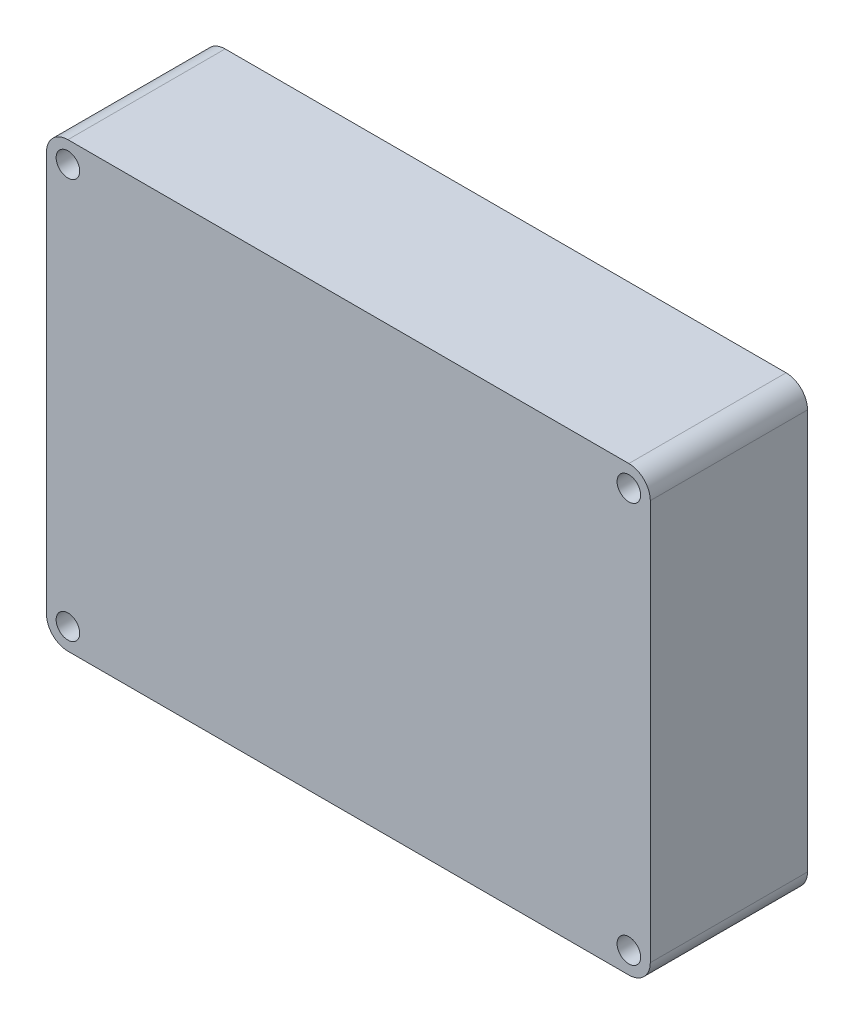
ISO-10303-21;
HEADER;
FILE_DESCRIPTION(('STEP AP214'),'2;1');
FILE_NAME('part.step','',(''),(''),'','','');
FILE_SCHEMA(('AUTOMOTIVE_DESIGN { 1 0 10303 214 1 1 1 1 }'));
ENDSEC;
DATA;
#1=APPLICATION_CONTEXT('core data for automotive mechanical design processes');
#2=APPLICATION_PROTOCOL_DEFINITION('international standard','automotive_design',2000,#1);
#3=PRODUCT_CONTEXT('',#1,'mechanical');
#4=PRODUCT('Part','Part','',(#3));
#5=PRODUCT_RELATED_PRODUCT_CATEGORY('part','',(#4));
#6=PRODUCT_DEFINITION_FORMATION('','',#4);
#7=PRODUCT_DEFINITION_CONTEXT('part definition',#1,'design');
#8=PRODUCT_DEFINITION('design','',#6,#7);
#9=PRODUCT_DEFINITION_SHAPE('','',#8);
#10=(LENGTH_UNIT() NAMED_UNIT(*) SI_UNIT(.MILLI.,.METRE.));
#11=(NAMED_UNIT(*) PLANE_ANGLE_UNIT() SI_UNIT($,.RADIAN.));
#12=(NAMED_UNIT(*) SI_UNIT($,.STERADIAN.) SOLID_ANGLE_UNIT());
#13=UNCERTAINTY_MEASURE_WITH_UNIT(LENGTH_MEASURE(1.E-05),#10,'distance_accuracy_value','');
#14=(GEOMETRIC_REPRESENTATION_CONTEXT(3) GLOBAL_UNCERTAINTY_ASSIGNED_CONTEXT((#13)) GLOBAL_UNIT_ASSIGNED_CONTEXT((#10,
#11,#12)) REPRESENTATION_CONTEXT('',''));
#15=CARTESIAN_POINT('',(0.,0.,0.));
#16=DIRECTION('',(0.,0.,1.));
#17=DIRECTION('',(1.,0.,0.));
#18=AXIS2_PLACEMENT_3D('',#15,#16,#17);
#19=CARTESIAN_POINT('',(0.,0.,22.));
#20=DIRECTION('',(0.,0.,-1.));
#21=DIRECTION('',(-1.,0.,0.));
#22=AXIS2_PLACEMENT_3D('',#19,#20,#21);
#23=PLANE('',#22);
#24=DIRECTION('',(0.,-1.,0.));
#25=VECTOR('',#24,1.);
#26=CARTESIAN_POINT('',(0.,0.,22.));
#27=LINE('',#26,#25);
#28=CARTESIAN_POINT('',(0.,59.,22.));
#29=VERTEX_POINT('',#28);
#30=CARTESIAN_POINT('',(0.,3.,22.));
#31=VERTEX_POINT('',#30);
#32=EDGE_CURVE('E146',#29,#31,#27,.T.);
#33=ORIENTED_EDGE('',*,*,#32,.T.);
#34=CARTESIAN_POINT('',(3.,3.,22.));
#35=DIRECTION('',(0.,0.,-1.));
#36=DIRECTION('',(-1.,0.,0.));
#37=AXIS2_PLACEMENT_3D('',#34,#35,#36);
#38=CIRCLE('',#37,3.);
#39=CARTESIAN_POINT('',(3.,0.,22.));
#40=VERTEX_POINT('',#39);
#41=EDGE_CURVE('E161',#31,#40,#38,.F.);
#42=ORIENTED_EDGE('',*,*,#41,.T.);
#43=DIRECTION('',(1.,0.,0.));
#44=VECTOR('',#43,1.);
#45=CARTESIAN_POINT('',(0.,0.,22.));
#46=LINE('',#45,#44);
#47=CARTESIAN_POINT('',(81.5,0.,22.));
#48=VERTEX_POINT('',#47);
#49=EDGE_CURVE('E128',#40,#48,#46,.T.);
#50=ORIENTED_EDGE('',*,*,#49,.T.);
#51=CARTESIAN_POINT('',(81.5,3.,22.));
#52=DIRECTION('',(0.,0.,-1.));
#53=DIRECTION('',(-1.,0.,0.));
#54=AXIS2_PLACEMENT_3D('',#51,#52,#53);
#55=CIRCLE('',#54,3.);
#56=CARTESIAN_POINT('',(84.5,3.,22.));
#57=VERTEX_POINT('',#56);
#58=EDGE_CURVE('E159',#48,#57,#55,.F.);
#59=ORIENTED_EDGE('',*,*,#58,.T.);
#60=DIRECTION('',(0.,1.,0.));
#61=VECTOR('',#60,1.);
#62=CARTESIAN_POINT('',(84.5,0.,22.));
#63=LINE('',#62,#61);
#64=CARTESIAN_POINT('',(84.5,59.,22.));
#65=VERTEX_POINT('',#64);
#66=EDGE_CURVE('E181',#57,#65,#63,.T.);
#67=ORIENTED_EDGE('',*,*,#66,.T.);
#68=CARTESIAN_POINT('',(81.5,59.,22.));
#69=DIRECTION('',(0.,0.,-1.));
#70=DIRECTION('',(-1.,0.,0.));
#71=AXIS2_PLACEMENT_3D('',#68,#69,#70);
#72=CIRCLE('',#71,3.);
#73=CARTESIAN_POINT('',(81.5,62.,22.));
#74=VERTEX_POINT('',#73);
#75=EDGE_CURVE('E63',#65,#74,#72,.F.);
#76=ORIENTED_EDGE('',*,*,#75,.T.);
#77=DIRECTION('',(-1.,0.,0.));
#78=VECTOR('',#77,1.);
#79=CARTESIAN_POINT('',(0.,62.,22.));
#80=LINE('',#79,#78);
#81=CARTESIAN_POINT('',(3.,62.,22.));
#82=VERTEX_POINT('',#81);
#83=EDGE_CURVE('E147',#74,#82,#80,.T.);
#84=ORIENTED_EDGE('',*,*,#83,.T.);
#85=CARTESIAN_POINT('',(3.,59.,22.));
#86=DIRECTION('',(0.,0.,-1.));
#87=DIRECTION('',(-1.,0.,0.));
#88=AXIS2_PLACEMENT_3D('',#85,#86,#87);
#89=CIRCLE('',#88,3.);
#90=EDGE_CURVE('E157',#82,#29,#89,.F.);
#91=ORIENTED_EDGE('',*,*,#90,.T.);
#92=EDGE_LOOP('',(#33,#42,#50,#59,#67,#76,#84,#91));
#93=FACE_BOUND('',#92,.T.);
#94=CARTESIAN_POINT('',(3.,3.,22.));
#95=DIRECTION('',(0.,0.,1.));
#96=DIRECTION('',(1.,0.,0.));
#97=AXIS2_PLACEMENT_3D('',#94,#95,#96);
#98=CIRCLE('',#97,1.65);
#99=CARTESIAN_POINT('',(4.65,3.,22.));
#100=VERTEX_POINT('',#99);
#101=EDGE_CURVE('E141',#100,#100,#98,.T.);
#102=ORIENTED_EDGE('',*,*,#101,.F.);
#103=EDGE_LOOP('',(#102));
#104=FACE_BOUND('',#103,.T.);
#105=CARTESIAN_POINT('',(81.5,3.,22.));
#106=DIRECTION('',(0.,0.,1.));
#107=DIRECTION('',(1.,0.,0.));
#108=AXIS2_PLACEMENT_3D('',#105,#106,#107);
#109=CIRCLE('',#108,1.65);
#110=CARTESIAN_POINT('',(83.15,3.,22.));
#111=VERTEX_POINT('',#110);
#112=EDGE_CURVE('E196',#111,#111,#109,.T.);
#113=ORIENTED_EDGE('',*,*,#112,.F.);
#114=EDGE_LOOP('',(#113));
#115=FACE_BOUND('',#114,.T.);
#116=CARTESIAN_POINT('',(81.5,59.,22.));
#117=DIRECTION('',(0.,0.,1.));
#118=DIRECTION('',(1.,0.,0.));
#119=AXIS2_PLACEMENT_3D('',#116,#117,#118);
#120=CIRCLE('',#119,1.65);
#121=CARTESIAN_POINT('',(83.15,59.,22.));
#122=VERTEX_POINT('',#121);
#123=EDGE_CURVE('E200',#122,#122,#120,.T.);
#124=ORIENTED_EDGE('',*,*,#123,.F.);
#125=EDGE_LOOP('',(#124));
#126=FACE_BOUND('',#125,.T.);
#127=CARTESIAN_POINT('',(3.,59.,22.));
#128=DIRECTION('',(0.,0.,1.));
#129=DIRECTION('',(1.,0.,0.));
#130=AXIS2_PLACEMENT_3D('',#127,#128,#129);
#131=CIRCLE('',#130,1.65);
#132=CARTESIAN_POINT('',(4.65,59.,22.));
#133=VERTEX_POINT('',#132);
#134=EDGE_CURVE('E203',#133,#133,#131,.T.);
#135=ORIENTED_EDGE('',*,*,#134,.F.);
#136=EDGE_LOOP('',(#135));
#137=FACE_BOUND('',#136,.T.);
#138=ADVANCED_FACE('F43',(#93,#104,#115,#126,#137),#23,.F.);
#139=CARTESIAN_POINT('',(0.,0.,0.));
#140=DIRECTION('',(0.,0.,-1.));
#141=DIRECTION('',(-1.,0.,0.));
#142=AXIS2_PLACEMENT_3D('',#139,#140,#141);
#143=PLANE('',#142);
#144=CARTESIAN_POINT('',(81.5,59.,0.));
#145=DIRECTION('',(0.,0.,1.));
#146=DIRECTION('',(1.,0.,0.));
#147=AXIS2_PLACEMENT_3D('',#144,#145,#146);
#148=CIRCLE('',#147,1.65);
#149=CARTESIAN_POINT('',(83.15,59.,0.));
#150=VERTEX_POINT('',#149);
#151=EDGE_CURVE('E205',#150,#150,#148,.T.);
#152=ORIENTED_EDGE('',*,*,#151,.T.);
#153=EDGE_LOOP('',(#152));
#154=FACE_BOUND('',#153,.T.);
#155=CARTESIAN_POINT('',(3.,3.,0.));
#156=DIRECTION('',(0.,0.,1.));
#157=DIRECTION('',(1.,0.,0.));
#158=AXIS2_PLACEMENT_3D('',#155,#156,#157);
#159=CIRCLE('',#158,1.65);
#160=CARTESIAN_POINT('',(4.65,3.,0.));
#161=VERTEX_POINT('',#160);
#162=EDGE_CURVE('E184',#161,#161,#159,.T.);
#163=ORIENTED_EDGE('',*,*,#162,.T.);
#164=EDGE_LOOP('',(#163));
#165=FACE_BOUND('',#164,.T.);
#166=DIRECTION('',(1.,0.,0.));
#167=VECTOR('',#166,1.);
#168=CARTESIAN_POINT('',(0.,0.,0.));
#169=LINE('',#168,#167);
#170=CARTESIAN_POINT('',(3.,0.,0.));
#171=VERTEX_POINT('',#170);
#172=CARTESIAN_POINT('',(81.5,0.,0.));
#173=VERTEX_POINT('',#172);
#174=EDGE_CURVE('E125',#171,#173,#169,.T.);
#175=ORIENTED_EDGE('',*,*,#174,.F.);
#176=CARTESIAN_POINT('',(3.,3.,0.));
#177=DIRECTION('',(0.,0.,-1.));
#178=DIRECTION('',(-1.,0.,0.));
#179=AXIS2_PLACEMENT_3D('',#176,#177,#178);
#180=CIRCLE('',#179,3.);
#181=CARTESIAN_POINT('',(0.,3.,0.));
#182=VERTEX_POINT('',#181);
#183=EDGE_CURVE('E108',#171,#182,#180,.T.);
#184=ORIENTED_EDGE('',*,*,#183,.T.);
#185=DIRECTION('',(0.,-1.,0.));
#186=VECTOR('',#185,1.);
#187=CARTESIAN_POINT('',(0.,0.,0.));
#188=LINE('',#187,#186);
#189=CARTESIAN_POINT('',(0.,59.,0.));
#190=VERTEX_POINT('',#189);
#191=EDGE_CURVE('E136',#190,#182,#188,.T.);
#192=ORIENTED_EDGE('',*,*,#191,.F.);
#193=CARTESIAN_POINT('',(3.,59.,0.));
#194=DIRECTION('',(0.,0.,-1.));
#195=DIRECTION('',(-1.,0.,0.));
#196=AXIS2_PLACEMENT_3D('',#193,#194,#195);
#197=CIRCLE('',#196,3.);
#198=CARTESIAN_POINT('',(3.,62.,0.));
#199=VERTEX_POINT('',#198);
#200=EDGE_CURVE('E150',#190,#199,#197,.T.);
#201=ORIENTED_EDGE('',*,*,#200,.T.);
#202=DIRECTION('',(-1.,0.,0.));
#203=VECTOR('',#202,1.);
#204=CARTESIAN_POINT('',(0.,62.,0.));
#205=LINE('',#204,#203);
#206=CARTESIAN_POINT('',(81.5,62.,0.));
#207=VERTEX_POINT('',#206);
#208=EDGE_CURVE('E139',#207,#199,#205,.T.);
#209=ORIENTED_EDGE('',*,*,#208,.F.);
#210=CARTESIAN_POINT('',(81.5,59.,0.));
#211=DIRECTION('',(0.,0.,-1.));
#212=DIRECTION('',(-1.,0.,0.));
#213=AXIS2_PLACEMENT_3D('',#210,#211,#212);
#214=CIRCLE('',#213,3.);
#215=CARTESIAN_POINT('',(84.5,59.,0.));
#216=VERTEX_POINT('',#215);
#217=EDGE_CURVE('E129',#207,#216,#214,.T.);
#218=ORIENTED_EDGE('',*,*,#217,.T.);
#219=DIRECTION('',(0.,1.,0.));
#220=VECTOR('',#219,1.);
#221=CARTESIAN_POINT('',(84.5,0.,0.));
#222=LINE('',#221,#220);
#223=CARTESIAN_POINT('',(84.5,3.,0.));
#224=VERTEX_POINT('',#223);
#225=EDGE_CURVE('E135',#224,#216,#222,.T.);
#226=ORIENTED_EDGE('',*,*,#225,.F.);
#227=CARTESIAN_POINT('',(81.5,3.,0.));
#228=DIRECTION('',(0.,0.,-1.));
#229=DIRECTION('',(-1.,0.,0.));
#230=AXIS2_PLACEMENT_3D('',#227,#228,#229);
#231=CIRCLE('',#230,3.);
#232=EDGE_CURVE('E119',#224,#173,#231,.T.);
#233=ORIENTED_EDGE('',*,*,#232,.T.);
#234=EDGE_LOOP('',(#175,#184,#192,#201,#209,#218,#226,#233));
#235=FACE_BOUND('',#234,.T.);
#236=CARTESIAN_POINT('',(81.5,3.,0.));
#237=DIRECTION('',(0.,0.,1.));
#238=DIRECTION('',(1.,0.,0.));
#239=AXIS2_PLACEMENT_3D('',#236,#237,#238);
#240=CIRCLE('',#239,1.65);
#241=CARTESIAN_POINT('',(83.15,3.,0.));
#242=VERTEX_POINT('',#241);
#243=EDGE_CURVE('E213',#242,#242,#240,.T.);
#244=ORIENTED_EDGE('',*,*,#243,.T.);
#245=EDGE_LOOP('',(#244));
#246=FACE_BOUND('',#245,.T.);
#247=CARTESIAN_POINT('',(3.,59.,0.));
#248=DIRECTION('',(0.,0.,1.));
#249=DIRECTION('',(1.,0.,0.));
#250=AXIS2_PLACEMENT_3D('',#247,#248,#249);
#251=CIRCLE('',#250,1.65);
#252=CARTESIAN_POINT('',(4.65,59.,0.));
#253=VERTEX_POINT('',#252);
#254=EDGE_CURVE('E206',#253,#253,#251,.T.);
#255=ORIENTED_EDGE('',*,*,#254,.T.);
#256=EDGE_LOOP('',(#255));
#257=FACE_BOUND('',#256,.T.);
#258=ADVANCED_FACE('F132',(#154,#165,#235,#246,#257),#143,.T.);
#259=CARTESIAN_POINT('',(0.,0.,22.));
#260=DIRECTION('',(1.,0.,0.));
#261=DIRECTION('',(0.,0.,-1.));
#262=AXIS2_PLACEMENT_3D('',#259,#260,#261);
#263=PLANE('',#262);
#264=ORIENTED_EDGE('',*,*,#191,.T.);
#265=DIRECTION('',(0.,0.,-1.));
#266=VECTOR('',#265,1.);
#267=CARTESIAN_POINT('',(0.,3.,22.));
#268=LINE('',#267,#266);
#269=EDGE_CURVE('E113',#182,#31,#268,.F.);
#270=ORIENTED_EDGE('',*,*,#269,.T.);
#271=ORIENTED_EDGE('',*,*,#32,.F.);
#272=DIRECTION('',(0.,0.,-1.));
#273=VECTOR('',#272,1.);
#274=CARTESIAN_POINT('',(0.,59.,22.));
#275=LINE('',#274,#273);
#276=EDGE_CURVE('E118',#29,#190,#275,.T.);
#277=ORIENTED_EDGE('',*,*,#276,.T.);
#278=EDGE_LOOP('',(#264,#270,#271,#277));
#279=FACE_BOUND('',#278,.T.);
#280=ADVANCED_FACE('F178',(#279),#263,.F.);
#281=CARTESIAN_POINT('',(0.,0.,22.));
#282=DIRECTION('',(0.,1.,0.));
#283=DIRECTION('',(0.,0.,1.));
#284=AXIS2_PLACEMENT_3D('',#281,#282,#283);
#285=PLANE('',#284);
#286=ORIENTED_EDGE('',*,*,#49,.F.);
#287=DIRECTION('',(0.,0.,-1.));
#288=VECTOR('',#287,1.);
#289=CARTESIAN_POINT('',(3.,0.,22.));
#290=LINE('',#289,#288);
#291=EDGE_CURVE('E112',#40,#171,#290,.T.);
#292=ORIENTED_EDGE('',*,*,#291,.T.);
#293=ORIENTED_EDGE('',*,*,#174,.T.);
#294=DIRECTION('',(0.,0.,-1.));
#295=VECTOR('',#294,1.);
#296=CARTESIAN_POINT('',(81.5,0.,22.));
#297=LINE('',#296,#295);
#298=EDGE_CURVE('E130',#173,#48,#297,.F.);
#299=ORIENTED_EDGE('',*,*,#298,.T.);
#300=EDGE_LOOP('',(#286,#292,#293,#299));
#301=FACE_BOUND('',#300,.T.);
#302=ADVANCED_FACE('F124',(#301),#285,.F.);
#303=CARTESIAN_POINT('',(84.5,0.,22.));
#304=DIRECTION('',(-1.,0.,0.));
#305=DIRECTION('',(0.,0.,1.));
#306=AXIS2_PLACEMENT_3D('',#303,#304,#305);
#307=PLANE('',#306);
#308=ORIENTED_EDGE('',*,*,#66,.F.);
#309=DIRECTION('',(0.,0.,-1.));
#310=VECTOR('',#309,1.);
#311=CARTESIAN_POINT('',(84.5,3.,22.));
#312=LINE('',#311,#310);
#313=EDGE_CURVE('E165',#57,#224,#312,.T.);
#314=ORIENTED_EDGE('',*,*,#313,.T.);
#315=ORIENTED_EDGE('',*,*,#225,.T.);
#316=DIRECTION('',(0.,0.,-1.));
#317=VECTOR('',#316,1.);
#318=CARTESIAN_POINT('',(84.5,59.,22.));
#319=LINE('',#318,#317);
#320=EDGE_CURVE('E163',#216,#65,#319,.F.);
#321=ORIENTED_EDGE('',*,*,#320,.T.);
#322=EDGE_LOOP('',(#308,#314,#315,#321));
#323=FACE_BOUND('',#322,.T.);
#324=ADVANCED_FACE('F233',(#323),#307,.F.);
#325=CARTESIAN_POINT('',(0.,62.,22.));
#326=DIRECTION('',(0.,-1.,0.));
#327=DIRECTION('',(0.,0.,-1.));
#328=AXIS2_PLACEMENT_3D('',#325,#326,#327);
#329=PLANE('',#328);
#330=ORIENTED_EDGE('',*,*,#208,.T.);
#331=DIRECTION('',(0.,0.,-1.));
#332=VECTOR('',#331,1.);
#333=CARTESIAN_POINT('',(3.,62.,22.));
#334=LINE('',#333,#332);
#335=EDGE_CURVE('E11',#199,#82,#334,.F.);
#336=ORIENTED_EDGE('',*,*,#335,.T.);
#337=ORIENTED_EDGE('',*,*,#83,.F.);
#338=DIRECTION('',(0.,0.,-1.));
#339=VECTOR('',#338,1.);
#340=CARTESIAN_POINT('',(81.5,62.,22.));
#341=LINE('',#340,#339);
#342=EDGE_CURVE('E51',#74,#207,#341,.T.);
#343=ORIENTED_EDGE('',*,*,#342,.T.);
#344=EDGE_LOOP('',(#330,#336,#337,#343));
#345=FACE_BOUND('',#344,.T.);
#346=ADVANCED_FACE('F170',(#345),#329,.F.);
#347=CARTESIAN_POINT('',(3.,3.,22.));
#348=DIRECTION('',(0.,0.,-1.));
#349=DIRECTION('',(-1.,0.,0.));
#350=AXIS2_PLACEMENT_3D('',#347,#348,#349);
#351=CYLINDRICAL_SURFACE('',#350,1.65);
#352=ORIENTED_EDGE('',*,*,#101,.T.);
#353=EDGE_LOOP('',(#352));
#354=FACE_BOUND('',#353,.T.);
#355=ORIENTED_EDGE('',*,*,#162,.F.);
#356=EDGE_LOOP('',(#355));
#357=FACE_BOUND('',#356,.T.);
#358=ADVANCED_FACE('F222',(#354,#357),#351,.F.);
#359=CARTESIAN_POINT('',(81.5,3.,22.));
#360=DIRECTION('',(0.,0.,-1.));
#361=DIRECTION('',(-1.,0.,0.));
#362=AXIS2_PLACEMENT_3D('',#359,#360,#361);
#363=CYLINDRICAL_SURFACE('',#362,1.65);
#364=ORIENTED_EDGE('',*,*,#112,.T.);
#365=EDGE_LOOP('',(#364));
#366=FACE_BOUND('',#365,.T.);
#367=ORIENTED_EDGE('',*,*,#243,.F.);
#368=EDGE_LOOP('',(#367));
#369=FACE_BOUND('',#368,.T.);
#370=ADVANCED_FACE('F224',(#366,#369),#363,.F.);
#371=CARTESIAN_POINT('',(81.5,59.,22.));
#372=DIRECTION('',(0.,0.,-1.));
#373=DIRECTION('',(-1.,0.,0.));
#374=AXIS2_PLACEMENT_3D('',#371,#372,#373);
#375=CYLINDRICAL_SURFACE('',#374,1.65);
#376=ORIENTED_EDGE('',*,*,#123,.T.);
#377=EDGE_LOOP('',(#376));
#378=FACE_BOUND('',#377,.T.);
#379=ORIENTED_EDGE('',*,*,#151,.F.);
#380=EDGE_LOOP('',(#379));
#381=FACE_BOUND('',#380,.T.);
#382=ADVANCED_FACE('F230',(#378,#381),#375,.F.);
#383=CARTESIAN_POINT('',(3.,59.,22.));
#384=DIRECTION('',(0.,0.,-1.));
#385=DIRECTION('',(-1.,0.,0.));
#386=AXIS2_PLACEMENT_3D('',#383,#384,#385);
#387=CYLINDRICAL_SURFACE('',#386,1.65);
#388=ORIENTED_EDGE('',*,*,#134,.T.);
#389=EDGE_LOOP('',(#388));
#390=FACE_BOUND('',#389,.T.);
#391=ORIENTED_EDGE('',*,*,#254,.F.);
#392=EDGE_LOOP('',(#391));
#393=FACE_BOUND('',#392,.T.);
#394=ADVANCED_FACE('F250',(#390,#393),#387,.F.);
#395=CARTESIAN_POINT('',(3.,3.,22.));
#396=DIRECTION('',(0.,0.,-1.));
#397=DIRECTION('',(-1.,0.,0.));
#398=AXIS2_PLACEMENT_3D('',#395,#396,#397);
#399=CYLINDRICAL_SURFACE('',#398,3.);
#400=ORIENTED_EDGE('',*,*,#41,.F.);
#401=ORIENTED_EDGE('',*,*,#269,.F.);
#402=ORIENTED_EDGE('',*,*,#183,.F.);
#403=ORIENTED_EDGE('',*,*,#291,.F.);
#404=EDGE_LOOP('',(#400,#401,#402,#403));
#405=FACE_BOUND('',#404,.T.);
#406=ADVANCED_FACE('F111',(#405),#399,.T.);
#407=CARTESIAN_POINT('',(81.5,3.,22.));
#408=DIRECTION('',(0.,0.,-1.));
#409=DIRECTION('',(-1.,0.,0.));
#410=AXIS2_PLACEMENT_3D('',#407,#408,#409);
#411=CYLINDRICAL_SURFACE('',#410,3.);
#412=ORIENTED_EDGE('',*,*,#58,.F.);
#413=ORIENTED_EDGE('',*,*,#298,.F.);
#414=ORIENTED_EDGE('',*,*,#232,.F.);
#415=ORIENTED_EDGE('',*,*,#313,.F.);
#416=EDGE_LOOP('',(#412,#413,#414,#415));
#417=FACE_BOUND('',#416,.T.);
#418=ADVANCED_FACE('F249',(#417),#411,.T.);
#419=CARTESIAN_POINT('',(3.,59.,22.));
#420=DIRECTION('',(0.,0.,-1.));
#421=DIRECTION('',(-1.,0.,0.));
#422=AXIS2_PLACEMENT_3D('',#419,#420,#421);
#423=CYLINDRICAL_SURFACE('',#422,3.);
#424=ORIENTED_EDGE('',*,*,#90,.F.);
#425=ORIENTED_EDGE('',*,*,#335,.F.);
#426=ORIENTED_EDGE('',*,*,#200,.F.);
#427=ORIENTED_EDGE('',*,*,#276,.F.);
#428=EDGE_LOOP('',(#424,#425,#426,#427));
#429=FACE_BOUND('',#428,.T.);
#430=ADVANCED_FACE('F175',(#429),#423,.T.);
#431=CARTESIAN_POINT('',(81.5,59.,22.));
#432=DIRECTION('',(0.,0.,-1.));
#433=DIRECTION('',(-1.,0.,0.));
#434=AXIS2_PLACEMENT_3D('',#431,#432,#433);
#435=CYLINDRICAL_SURFACE('',#434,3.);
#436=ORIENTED_EDGE('',*,*,#75,.F.);
#437=ORIENTED_EDGE('',*,*,#320,.F.);
#438=ORIENTED_EDGE('',*,*,#217,.F.);
#439=ORIENTED_EDGE('',*,*,#342,.F.);
#440=EDGE_LOOP('',(#436,#437,#438,#439));
#441=FACE_BOUND('',#440,.T.);
#442=ADVANCED_FACE('F45',(#441),#435,.T.);
#443=CLOSED_SHELL('',(#138,#258,#280,#302,#324,#346,#358,#370,#382,#394,#406,#418,#430,#442));
#444=MANIFOLD_SOLID_BREP('B2',#443);
#445=ADVANCED_BREP_SHAPE_REPRESENTATION('',(#18,#444),#14);
#446=SHAPE_DEFINITION_REPRESENTATION(#9,#445);
ENDSEC;
END-ISO-10303-21;
